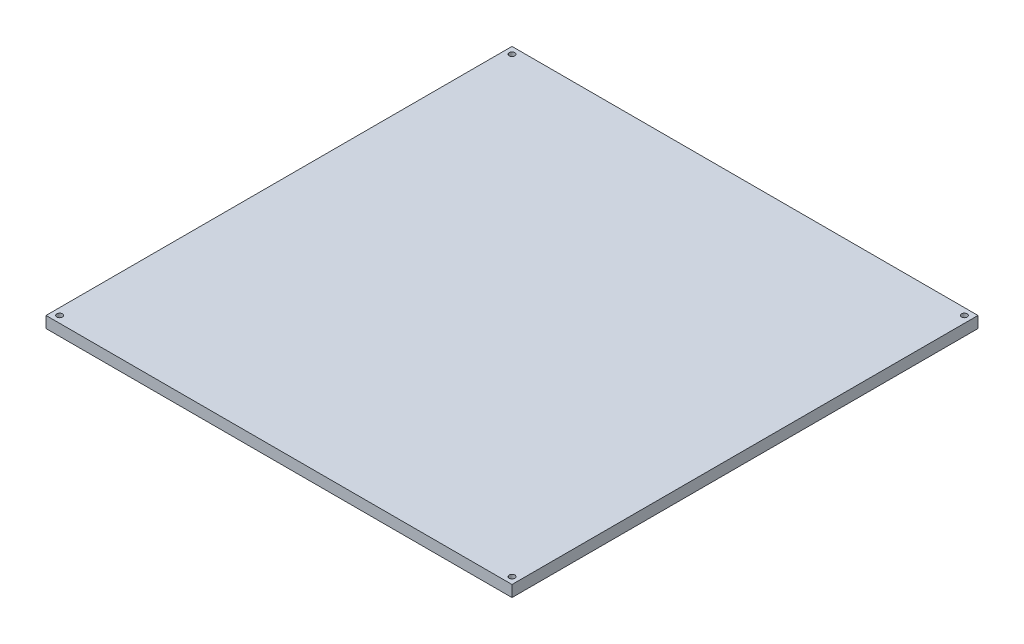
ISO-10303-21;
HEADER;
FILE_DESCRIPTION(('STEP AP214'),'2;1');
FILE_NAME('part.step','',(''),(''),'','','');
FILE_SCHEMA(('AUTOMOTIVE_DESIGN { 1 0 10303 214 1 1 1 1 }'));
ENDSEC;
DATA;
#1=APPLICATION_CONTEXT('core data for automotive mechanical design processes');
#2=APPLICATION_PROTOCOL_DEFINITION('international standard','automotive_design',2000,#1);
#3=PRODUCT_CONTEXT('',#1,'mechanical');
#4=PRODUCT('Part','Part','',(#3));
#5=PRODUCT_RELATED_PRODUCT_CATEGORY('part','',(#4));
#6=PRODUCT_DEFINITION_FORMATION('','',#4);
#7=PRODUCT_DEFINITION_CONTEXT('part definition',#1,'design');
#8=PRODUCT_DEFINITION('design','',#6,#7);
#9=PRODUCT_DEFINITION_SHAPE('','',#8);
#10=(LENGTH_UNIT() NAMED_UNIT(*) SI_UNIT(.MILLI.,.METRE.));
#11=(NAMED_UNIT(*) PLANE_ANGLE_UNIT() SI_UNIT($,.RADIAN.));
#12=(NAMED_UNIT(*) SI_UNIT($,.STERADIAN.) SOLID_ANGLE_UNIT());
#13=UNCERTAINTY_MEASURE_WITH_UNIT(LENGTH_MEASURE(1.E-05),#10,'distance_accuracy_value','');
#14=(GEOMETRIC_REPRESENTATION_CONTEXT(3) GLOBAL_UNCERTAINTY_ASSIGNED_CONTEXT((#13)) GLOBAL_UNIT_ASSIGNED_CONTEXT((#10,
#11,#12)) REPRESENTATION_CONTEXT('',''));
#15=CARTESIAN_POINT('',(0.,0.,0.));
#16=DIRECTION('',(0.,0.,1.));
#17=DIRECTION('',(1.,0.,0.));
#18=AXIS2_PLACEMENT_3D('',#15,#16,#17);
#19=CARTESIAN_POINT('',(102.5,5.,102.5));
#20=DIRECTION('',(-1.,0.,0.));
#21=DIRECTION('',(0.,0.,1.));
#22=AXIS2_PLACEMENT_3D('',#19,#20,#21);
#23=PLANE('',#22);
#24=DIRECTION('',(0.,0.,-1.));
#25=VECTOR('',#24,1.);
#26=CARTESIAN_POINT('',(102.5,0.,102.5));
#27=LINE('',#26,#25);
#28=CARTESIAN_POINT('',(102.5,0.,102.5));
#29=VERTEX_POINT('',#28);
#30=CARTESIAN_POINT('',(102.5,0.,-102.5));
#31=VERTEX_POINT('',#30);
#32=EDGE_CURVE('E102',#29,#31,#27,.T.);
#33=ORIENTED_EDGE('',*,*,#32,.T.);
#34=DIRECTION('',(0.,-1.,0.));
#35=VECTOR('',#34,1.);
#36=CARTESIAN_POINT('',(102.5,5.,-102.5));
#37=LINE('',#36,#35);
#38=CARTESIAN_POINT('',(102.5,5.,-102.5));
#39=VERTEX_POINT('',#38);
#40=EDGE_CURVE('E11',#39,#31,#37,.T.);
#41=ORIENTED_EDGE('',*,*,#40,.F.);
#42=DIRECTION('',(0.,0.,-1.));
#43=VECTOR('',#42,1.);
#44=CARTESIAN_POINT('',(102.5,5.,102.5));
#45=LINE('',#44,#43);
#46=CARTESIAN_POINT('',(102.5,5.,102.5));
#47=VERTEX_POINT('',#46);
#48=EDGE_CURVE('E90',#47,#39,#45,.T.);
#49=ORIENTED_EDGE('',*,*,#48,.F.);
#50=DIRECTION('',(0.,-1.,0.));
#51=VECTOR('',#50,1.);
#52=CARTESIAN_POINT('',(102.5,5.,102.5));
#53=LINE('',#52,#51);
#54=EDGE_CURVE('E98',#47,#29,#53,.T.);
#55=ORIENTED_EDGE('',*,*,#54,.T.);
#56=EDGE_LOOP('',(#33,#41,#49,#55));
#57=FACE_BOUND('',#56,.T.);
#58=ADVANCED_FACE('F39',(#57),#23,.F.);
#59=CARTESIAN_POINT('',(-102.5,5.,-102.5));
#60=DIRECTION('',(0.,0.,1.));
#61=DIRECTION('',(1.,0.,0.));
#62=AXIS2_PLACEMENT_3D('',#59,#60,#61);
#63=PLANE('',#62);
#64=DIRECTION('',(-1.,0.,0.));
#65=VECTOR('',#64,1.);
#66=CARTESIAN_POINT('',(-102.5,0.,-102.5));
#67=LINE('',#66,#65);
#68=CARTESIAN_POINT('',(-102.5,0.,-102.5));
#69=VERTEX_POINT('',#68);
#70=EDGE_CURVE('E94',#31,#69,#67,.T.);
#71=ORIENTED_EDGE('',*,*,#70,.T.);
#72=DIRECTION('',(0.,-1.,0.));
#73=VECTOR('',#72,1.);
#74=CARTESIAN_POINT('',(-102.5,5.,-102.5));
#75=LINE('',#74,#73);
#76=CARTESIAN_POINT('',(-102.5,5.,-102.5));
#77=VERTEX_POINT('',#76);
#78=EDGE_CURVE('E47',#77,#69,#75,.T.);
#79=ORIENTED_EDGE('',*,*,#78,.F.);
#80=DIRECTION('',(-1.,0.,0.));
#81=VECTOR('',#80,1.);
#82=CARTESIAN_POINT('',(-102.5,5.,-102.5));
#83=LINE('',#82,#81);
#84=EDGE_CURVE('E85',#39,#77,#83,.T.);
#85=ORIENTED_EDGE('',*,*,#84,.F.);
#86=ORIENTED_EDGE('',*,*,#40,.T.);
#87=EDGE_LOOP('',(#71,#79,#85,#86));
#88=FACE_BOUND('',#87,.T.);
#89=ADVANCED_FACE('F93',(#88),#63,.F.);
#90=CARTESIAN_POINT('',(-102.5,5.,102.5));
#91=DIRECTION('',(1.,0.,0.));
#92=DIRECTION('',(0.,0.,-1.));
#93=AXIS2_PLACEMENT_3D('',#90,#91,#92);
#94=PLANE('',#93);
#95=DIRECTION('',(0.,0.,1.));
#96=VECTOR('',#95,1.);
#97=CARTESIAN_POINT('',(-102.5,0.,102.5));
#98=LINE('',#97,#96);
#99=CARTESIAN_POINT('',(-102.5,0.,102.5));
#100=VERTEX_POINT('',#99);
#101=EDGE_CURVE('E72',#69,#100,#98,.T.);
#102=ORIENTED_EDGE('',*,*,#101,.T.);
#103=DIRECTION('',(0.,-1.,0.));
#104=VECTOR('',#103,1.);
#105=CARTESIAN_POINT('',(-102.5,5.,102.5));
#106=LINE('',#105,#104);
#107=CARTESIAN_POINT('',(-102.5,5.,102.5));
#108=VERTEX_POINT('',#107);
#109=EDGE_CURVE('E95',#108,#100,#106,.T.);
#110=ORIENTED_EDGE('',*,*,#109,.F.);
#111=DIRECTION('',(0.,0.,1.));
#112=VECTOR('',#111,1.);
#113=CARTESIAN_POINT('',(-102.5,5.,102.5));
#114=LINE('',#113,#112);
#115=EDGE_CURVE('E88',#77,#108,#114,.T.);
#116=ORIENTED_EDGE('',*,*,#115,.F.);
#117=ORIENTED_EDGE('',*,*,#78,.T.);
#118=EDGE_LOOP('',(#102,#110,#116,#117));
#119=FACE_BOUND('',#118,.T.);
#120=ADVANCED_FACE('F96',(#119),#94,.F.);
#121=CARTESIAN_POINT('',(-102.5,5.,102.5));
#122=DIRECTION('',(0.,0.,-1.));
#123=DIRECTION('',(-1.,0.,0.));
#124=AXIS2_PLACEMENT_3D('',#121,#122,#123);
#125=PLANE('',#124);
#126=DIRECTION('',(1.,0.,0.));
#127=VECTOR('',#126,1.);
#128=CARTESIAN_POINT('',(-102.5,0.,102.5));
#129=LINE('',#128,#127);
#130=EDGE_CURVE('E78',#100,#29,#129,.T.);
#131=ORIENTED_EDGE('',*,*,#130,.T.);
#132=ORIENTED_EDGE('',*,*,#54,.F.);
#133=DIRECTION('',(1.,0.,0.));
#134=VECTOR('',#133,1.);
#135=CARTESIAN_POINT('',(-102.5,5.,102.5));
#136=LINE('',#135,#134);
#137=EDGE_CURVE('E55',#108,#47,#136,.T.);
#138=ORIENTED_EDGE('',*,*,#137,.F.);
#139=ORIENTED_EDGE('',*,*,#109,.T.);
#140=EDGE_LOOP('',(#131,#132,#138,#139));
#141=FACE_BOUND('',#140,.T.);
#142=ADVANCED_FACE('F110',(#141),#125,.F.);
#143=CARTESIAN_POINT('',(0.,5.,0.));
#144=DIRECTION('',(0.,-1.,0.));
#145=DIRECTION('',(0.,0.,-1.));
#146=AXIS2_PLACEMENT_3D('',#143,#144,#145);
#147=PLANE('',#146);
#148=CARTESIAN_POINT('',(-99.5,5.,-99.5));
#149=DIRECTION('',(0.,1.,0.));
#150=DIRECTION('',(0.,0.,1.));
#151=AXIS2_PLACEMENT_3D('',#148,#149,#150);
#152=CIRCLE('',#151,1.25);
#153=CARTESIAN_POINT('',(-99.5,5.,-98.25));
#154=VERTEX_POINT('',#153);
#155=EDGE_CURVE('E136',#154,#154,#152,.T.);
#156=ORIENTED_EDGE('',*,*,#155,.F.);
#157=EDGE_LOOP('',(#156));
#158=FACE_BOUND('',#157,.T.);
#159=CARTESIAN_POINT('',(99.5,5.,99.5));
#160=DIRECTION('',(0.,1.,0.));
#161=DIRECTION('',(0.,0.,1.));
#162=AXIS2_PLACEMENT_3D('',#159,#160,#161);
#163=CIRCLE('',#162,1.25);
#164=CARTESIAN_POINT('',(99.5,5.,100.75));
#165=VERTEX_POINT('',#164);
#166=EDGE_CURVE('E130',#165,#165,#163,.T.);
#167=ORIENTED_EDGE('',*,*,#166,.F.);
#168=EDGE_LOOP('',(#167));
#169=FACE_BOUND('',#168,.T.);
#170=CARTESIAN_POINT('',(-99.5,5.,99.5));
#171=DIRECTION('',(0.,1.,0.));
#172=DIRECTION('',(0.,0.,1.));
#173=AXIS2_PLACEMENT_3D('',#170,#171,#172);
#174=CIRCLE('',#173,1.25);
#175=CARTESIAN_POINT('',(-99.5,5.,100.75));
#176=VERTEX_POINT('',#175);
#177=EDGE_CURVE('E124',#176,#176,#174,.T.);
#178=ORIENTED_EDGE('',*,*,#177,.F.);
#179=EDGE_LOOP('',(#178));
#180=FACE_BOUND('',#179,.T.);
#181=CARTESIAN_POINT('',(99.5,5.,-99.5));
#182=DIRECTION('',(0.,1.,0.));
#183=DIRECTION('',(0.,0.,1.));
#184=AXIS2_PLACEMENT_3D('',#181,#182,#183);
#185=CIRCLE('',#184,1.25);
#186=CARTESIAN_POINT('',(99.5,5.,-98.25));
#187=VERTEX_POINT('',#186);
#188=EDGE_CURVE('E118',#187,#187,#185,.T.);
#189=ORIENTED_EDGE('',*,*,#188,.F.);
#190=EDGE_LOOP('',(#189));
#191=FACE_BOUND('',#190,.T.);
#192=ORIENTED_EDGE('',*,*,#48,.T.);
#193=ORIENTED_EDGE('',*,*,#84,.T.);
#194=ORIENTED_EDGE('',*,*,#115,.T.);
#195=ORIENTED_EDGE('',*,*,#137,.T.);
#196=EDGE_LOOP('',(#192,#193,#194,#195));
#197=FACE_BOUND('',#196,.T.);
#198=ADVANCED_FACE('F86',(#158,#169,#180,#191,#197),#147,.F.);
#199=CARTESIAN_POINT('',(0.,0.,0.));
#200=DIRECTION('',(0.,-1.,0.));
#201=DIRECTION('',(0.,0.,-1.));
#202=AXIS2_PLACEMENT_3D('',#199,#200,#201);
#203=PLANE('',#202);
#204=CARTESIAN_POINT('',(-99.5,0.,-99.5));
#205=DIRECTION('',(0.,1.,0.));
#206=DIRECTION('',(0.,0.,1.));
#207=AXIS2_PLACEMENT_3D('',#204,#205,#206);
#208=CIRCLE('',#207,1.25);
#209=CARTESIAN_POINT('',(-99.5,0.,-98.25));
#210=VERTEX_POINT('',#209);
#211=EDGE_CURVE('E133',#210,#210,#208,.T.);
#212=ORIENTED_EDGE('',*,*,#211,.T.);
#213=EDGE_LOOP('',(#212));
#214=FACE_BOUND('',#213,.T.);
#215=CARTESIAN_POINT('',(99.5,0.,99.5));
#216=DIRECTION('',(0.,1.,0.));
#217=DIRECTION('',(0.,0.,1.));
#218=AXIS2_PLACEMENT_3D('',#215,#216,#217);
#219=CIRCLE('',#218,1.25);
#220=CARTESIAN_POINT('',(99.5,0.,100.75));
#221=VERTEX_POINT('',#220);
#222=EDGE_CURVE('E127',#221,#221,#219,.T.);
#223=ORIENTED_EDGE('',*,*,#222,.T.);
#224=EDGE_LOOP('',(#223));
#225=FACE_BOUND('',#224,.T.);
#226=CARTESIAN_POINT('',(-99.5,0.,99.5));
#227=DIRECTION('',(0.,1.,0.));
#228=DIRECTION('',(0.,0.,1.));
#229=AXIS2_PLACEMENT_3D('',#226,#227,#228);
#230=CIRCLE('',#229,1.25);
#231=CARTESIAN_POINT('',(-99.5,0.,100.75));
#232=VERTEX_POINT('',#231);
#233=EDGE_CURVE('E121',#232,#232,#230,.T.);
#234=ORIENTED_EDGE('',*,*,#233,.T.);
#235=EDGE_LOOP('',(#234));
#236=FACE_BOUND('',#235,.T.);
#237=CARTESIAN_POINT('',(99.5,0.,-99.5));
#238=DIRECTION('',(0.,1.,0.));
#239=DIRECTION('',(0.,0.,1.));
#240=AXIS2_PLACEMENT_3D('',#237,#238,#239);
#241=CIRCLE('',#240,1.25);
#242=CARTESIAN_POINT('',(99.5,0.,-98.25));
#243=VERTEX_POINT('',#242);
#244=EDGE_CURVE('E105',#243,#243,#241,.T.);
#245=ORIENTED_EDGE('',*,*,#244,.T.);
#246=EDGE_LOOP('',(#245));
#247=FACE_BOUND('',#246,.T.);
#248=ORIENTED_EDGE('',*,*,#32,.F.);
#249=ORIENTED_EDGE('',*,*,#130,.F.);
#250=ORIENTED_EDGE('',*,*,#101,.F.);
#251=ORIENTED_EDGE('',*,*,#70,.F.);
#252=EDGE_LOOP('',(#248,#249,#250,#251));
#253=FACE_BOUND('',#252,.T.);
#254=ADVANCED_FACE('F113',(#214,#225,#236,#247,#253),#203,.T.);
#255=CARTESIAN_POINT('',(99.5,5.,-99.5));
#256=DIRECTION('',(0.,1.,0.));
#257=DIRECTION('',(0.,0.,1.));
#258=AXIS2_PLACEMENT_3D('',#255,#256,#257);
#259=CYLINDRICAL_SURFACE('',#258,1.25);
#260=ORIENTED_EDGE('',*,*,#244,.F.);
#261=EDGE_LOOP('',(#260));
#262=FACE_BOUND('',#261,.T.);
#263=ORIENTED_EDGE('',*,*,#188,.T.);
#264=EDGE_LOOP('',(#263));
#265=FACE_BOUND('',#264,.T.);
#266=ADVANCED_FACE('F151',(#262,#265),#259,.F.);
#267=CARTESIAN_POINT('',(-99.5,5.,99.5));
#268=DIRECTION('',(0.,1.,0.));
#269=DIRECTION('',(0.,0.,1.));
#270=AXIS2_PLACEMENT_3D('',#267,#268,#269);
#271=CYLINDRICAL_SURFACE('',#270,1.25);
#272=ORIENTED_EDGE('',*,*,#233,.F.);
#273=EDGE_LOOP('',(#272));
#274=FACE_BOUND('',#273,.T.);
#275=ORIENTED_EDGE('',*,*,#177,.T.);
#276=EDGE_LOOP('',(#275));
#277=FACE_BOUND('',#276,.T.);
#278=ADVANCED_FACE('F153',(#274,#277),#271,.F.);
#279=CARTESIAN_POINT('',(99.5,5.,99.5));
#280=DIRECTION('',(0.,1.,0.));
#281=DIRECTION('',(0.,0.,1.));
#282=AXIS2_PLACEMENT_3D('',#279,#280,#281);
#283=CYLINDRICAL_SURFACE('',#282,1.25);
#284=ORIENTED_EDGE('',*,*,#222,.F.);
#285=EDGE_LOOP('',(#284));
#286=FACE_BOUND('',#285,.T.);
#287=ORIENTED_EDGE('',*,*,#166,.T.);
#288=EDGE_LOOP('',(#287));
#289=FACE_BOUND('',#288,.T.);
#290=ADVANCED_FACE('F160',(#286,#289),#283,.F.);
#291=CARTESIAN_POINT('',(-99.5,5.,-99.5));
#292=DIRECTION('',(0.,1.,0.));
#293=DIRECTION('',(0.,0.,1.));
#294=AXIS2_PLACEMENT_3D('',#291,#292,#293);
#295=CYLINDRICAL_SURFACE('',#294,1.25);
#296=ORIENTED_EDGE('',*,*,#211,.F.);
#297=EDGE_LOOP('',(#296));
#298=FACE_BOUND('',#297,.T.);
#299=ORIENTED_EDGE('',*,*,#155,.T.);
#300=EDGE_LOOP('',(#299));
#301=FACE_BOUND('',#300,.T.);
#302=ADVANCED_FACE('F140',(#298,#301),#295,.F.);
#303=CLOSED_SHELL('',(#58,#89,#120,#142,#198,#254,#266,#278,#290,#302));
#304=MANIFOLD_SOLID_BREP('B2',#303);
#305=ADVANCED_BREP_SHAPE_REPRESENTATION('',(#18,#304),#14);
#306=SHAPE_DEFINITION_REPRESENTATION(#9,#305);
ENDSEC;
END-ISO-10303-21;
